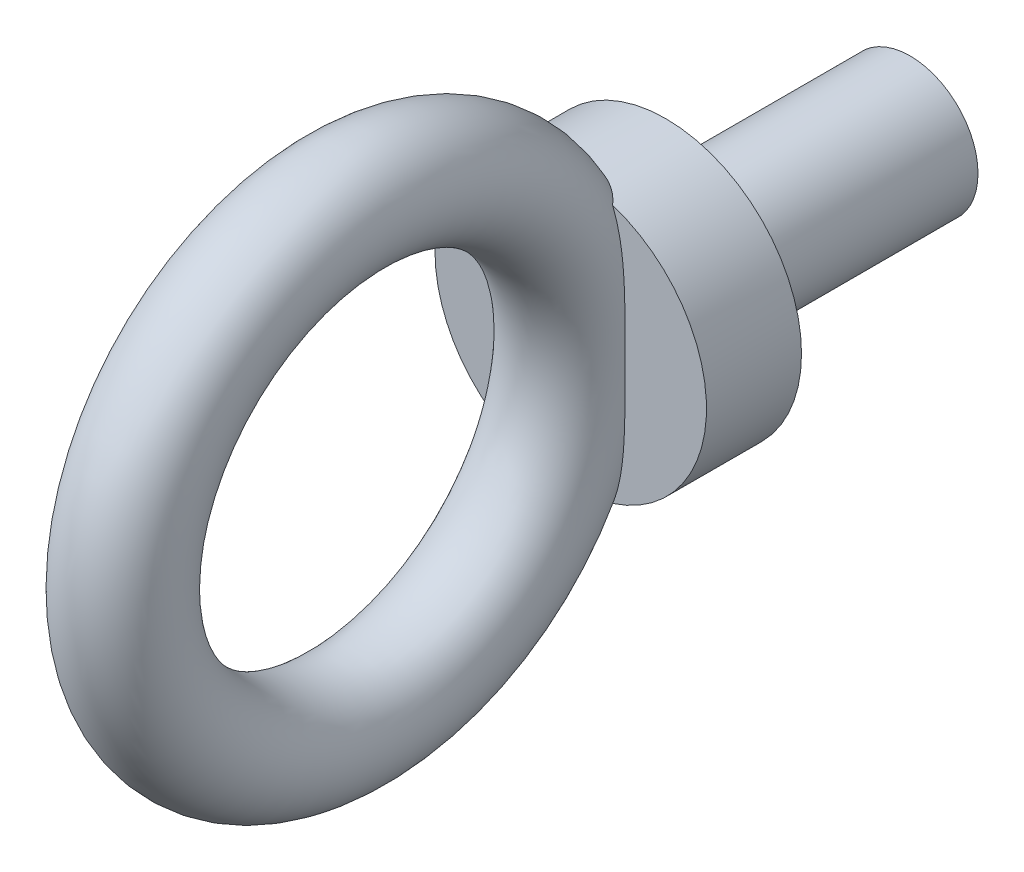
ISO-10303-21;
HEADER;
FILE_DESCRIPTION(('STEP AP214'),'2;1');
FILE_NAME('part.step','',(''),(''),'','','');
FILE_SCHEMA(('AUTOMOTIVE_DESIGN { 1 0 10303 214 1 1 1 1 }'));
ENDSEC;
DATA;
#1=APPLICATION_CONTEXT('core data for automotive mechanical design processes');
#2=APPLICATION_PROTOCOL_DEFINITION('international standard','automotive_design',2000,#1);
#3=PRODUCT_CONTEXT('',#1,'mechanical');
#4=PRODUCT('Part','Part','',(#3));
#5=PRODUCT_RELATED_PRODUCT_CATEGORY('part','',(#4));
#6=PRODUCT_DEFINITION_FORMATION('','',#4);
#7=PRODUCT_DEFINITION_CONTEXT('part definition',#1,'design');
#8=PRODUCT_DEFINITION('design','',#6,#7);
#9=PRODUCT_DEFINITION_SHAPE('','',#8);
#10=(LENGTH_UNIT() NAMED_UNIT(*) SI_UNIT(.MILLI.,.METRE.));
#11=(NAMED_UNIT(*) PLANE_ANGLE_UNIT() SI_UNIT($,.RADIAN.));
#12=(NAMED_UNIT(*) SI_UNIT($,.STERADIAN.) SOLID_ANGLE_UNIT());
#13=UNCERTAINTY_MEASURE_WITH_UNIT(LENGTH_MEASURE(1.E-05),#10,'distance_accuracy_value','');
#14=(GEOMETRIC_REPRESENTATION_CONTEXT(3) GLOBAL_UNCERTAINTY_ASSIGNED_CONTEXT((#13)) GLOBAL_UNIT_ASSIGNED_CONTEXT((#10,
#11,#12)) REPRESENTATION_CONTEXT('',''));
#15=CARTESIAN_POINT('',(0.,0.,0.));
#16=DIRECTION('',(0.,0.,1.));
#17=DIRECTION('',(1.,0.,0.));
#18=AXIS2_PLACEMENT_3D('',#15,#16,#17);
#19=CARTESIAN_POINT('',(0.,0.,25.));
#20=DIRECTION('',(0.,0.,-1.));
#21=DIRECTION('',(-1.,0.,0.));
#22=AXIS2_PLACEMENT_3D('',#19,#20,#21);
#23=CYLINDRICAL_SURFACE('',#22,5.);
#24=CARTESIAN_POINT('',(0.,0.,18.));
#25=DIRECTION('',(0.,0.,-1.));
#26=DIRECTION('',(-1.,0.,0.));
#27=AXIS2_PLACEMENT_3D('',#24,#25,#26);
#28=CIRCLE('',#27,5.);
#29=CARTESIAN_POINT('',(-5.,0.,18.));
#30=VERTEX_POINT('',#29);
#31=EDGE_CURVE('E44',#30,#30,#28,.T.);
#32=ORIENTED_EDGE('',*,*,#31,.T.);
#33=EDGE_LOOP('',(#32));
#34=FACE_BOUND('',#33,.T.);
#35=CARTESIAN_POINT('',(0.,0.,0.));
#36=DIRECTION('',(0.,0.,1.));
#37=DIRECTION('',(1.,0.,0.));
#38=AXIS2_PLACEMENT_3D('',#35,#36,#37);
#39=CIRCLE('',#38,5.);
#40=CARTESIAN_POINT('',(5.,0.,0.));
#41=VERTEX_POINT('',#40);
#42=EDGE_CURVE('E71',#41,#41,#39,.T.);
#43=ORIENTED_EDGE('',*,*,#42,.T.);
#44=EDGE_LOOP('',(#43));
#45=FACE_BOUND('',#44,.T.);
#46=ADVANCED_FACE('F41',(#34,#45),#23,.T.);
#47=CARTESIAN_POINT('',(0.,0.,0.));
#48=DIRECTION('',(0.,0.,1.));
#49=DIRECTION('',(1.,0.,0.));
#50=AXIS2_PLACEMENT_3D('',#47,#48,#49);
#51=PLANE('',#50);
#52=ORIENTED_EDGE('',*,*,#42,.F.);
#53=EDGE_LOOP('',(#52));
#54=FACE_BOUND('',#53,.T.);
#55=ADVANCED_FACE('F111',(#54),#51,.F.);
#56=CARTESIAN_POINT('',(0.,0.,18.));
#57=DIRECTION('',(0.,0.,-1.));
#58=DIRECTION('',(-1.,0.,0.));
#59=AXIS2_PLACEMENT_3D('',#56,#57,#58);
#60=PLANE('',#59);
#61=CARTESIAN_POINT('',(0.,0.,18.));
#62=DIRECTION('',(0.,0.,-1.));
#63=DIRECTION('',(-1.,0.,0.));
#64=AXIS2_PLACEMENT_3D('',#61,#62,#63);
#65=CIRCLE('',#64,10.);
#66=CARTESIAN_POINT('',(-10.,0.,18.));
#67=VERTEX_POINT('',#66);
#68=EDGE_CURVE('E82',#67,#67,#65,.T.);
#69=ORIENTED_EDGE('',*,*,#68,.T.);
#70=EDGE_LOOP('',(#69));
#71=FACE_BOUND('',#70,.T.);
#72=ORIENTED_EDGE('',*,*,#31,.F.);
#73=EDGE_LOOP('',(#72));
#74=FACE_BOUND('',#73,.T.);
#75=ADVANCED_FACE('F107',(#71,#74),#60,.T.);
#76=CARTESIAN_POINT('',(0.,0.,25.));
#77=DIRECTION('',(0.,0.,-1.));
#78=DIRECTION('',(-1.,0.,0.));
#79=AXIS2_PLACEMENT_3D('',#76,#77,#78);
#80=CYLINDRICAL_SURFACE('',#79,10.);
#81=ORIENTED_EDGE('',*,*,#68,.F.);
#82=EDGE_LOOP('',(#81));
#83=FACE_BOUND('',#82,.T.);
#84=CARTESIAN_POINT('',(3.08572184304947,9.51200928864808,25.0002));
#85=CARTESIAN_POINT('',(3.01756601337417,9.53412381358471,24.9175378057415));
#86=CARTESIAN_POINT('',(2.94580374612916,9.55658994722712,24.8379538660344));
#87=CARTESIAN_POINT('',(2.79561887336156,9.60159541408919,24.6853953160806));
#88=CARTESIAN_POINT('',(2.71719765726388,9.6241347310994,24.6124193335833));
#89=CARTESIAN_POINT('',(2.55435535244625,9.66862890900416,24.4736113090858));
#90=CARTESIAN_POINT('',(2.46994455302816,9.69058468720985,24.4077674842529));
#91=CARTESIAN_POINT('',(2.29561388577804,9.73335550958551,24.2834094722509));
#92=CARTESIAN_POINT('',(2.20569389556146,9.75417052839447,24.2248954479985));
#93=CARTESIAN_POINT('',(2.02101941430129,9.79410035671315,24.1154790566684));
#94=CARTESIAN_POINT('',(1.92626646082608,9.81321570171645,24.0645742887763));
#95=CARTESIAN_POINT('',(1.73253704998955,9.84926524220758,23.970539027512));
#96=CARTESIAN_POINT('',(1.63355903856122,9.866198625758,23.9274114257576));
#97=CARTESIAN_POINT('',(1.43213420654376,9.89744286380575,23.8491194834181));
#98=CARTESIAN_POINT('',(1.32968833422883,9.9117544284755,23.8139529857976));
#99=CARTESIAN_POINT('',(1.12197621895332,9.93741031264149,23.7516733654917));
#100=CARTESIAN_POINT('',(1.01670899615198,9.9487535861501,23.7245630812572));
#101=CARTESIAN_POINT('',(0.802547889080411,9.96833221510091,23.6781576217276));
#102=CARTESIAN_POINT('',(0.693623444827328,9.97651946364043,23.658983110066));
#103=CARTESIAN_POINT('',(0.474413725959301,9.98934363234647,23.6290874901616));
#104=CARTESIAN_POINT('',(0.364128438699724,9.99398051949858,23.6183664605267));
#105=CARTESIAN_POINT('',(0.14293474704309,9.99959062041027,23.6054076169455));
#106=CARTESIAN_POINT('',(0.0320261667254642,10.0005627418161,23.6031723323371));
#107=CARTESIAN_POINT('',(-0.189569384871622,9.99881675194974,23.607197771108));
#108=CARTESIAN_POINT('',(-0.300256418918661,9.99609990134791,23.6134555920509));
#109=CARTESIAN_POINT('',(-0.521707793453181,9.98700235759581,23.6345422774887));
#110=CARTESIAN_POINT('',(-0.632463160247915,9.98058760883945,23.6494508188513));
#111=CARTESIAN_POINT('',(-0.852169751938588,9.9642328996887,23.6878475985572));
#112=CARTESIAN_POINT('',(-0.961121633333386,9.95429425296488,23.711332639773));
#113=CARTESIAN_POINT('',(-1.17655273754486,9.93113630031529,23.7668270766499));
#114=CARTESIAN_POINT('',(-1.28303031787159,9.91791487962493,23.79884196822));
#115=CARTESIAN_POINT('',(-1.49262863963998,9.88854157661549,23.8712682003511));
#116=CARTESIAN_POINT('',(-1.59575065634544,9.87239082328377,23.9116763069705));
#117=CARTESIAN_POINT('',(-1.79772884048281,9.83761417268163,24.0006633433689));
#118=CARTESIAN_POINT('',(-1.89659292505752,9.81899315735014,24.0492262060951));
#119=CARTESIAN_POINT('',(-2.08950002951953,9.77975840898319,24.1543642672904));
#120=CARTESIAN_POINT('',(-2.18354496799336,9.75914547854557,24.2109362429034));
#121=CARTESIAN_POINT('',(-2.36604129797,9.71651278545709,24.3317800948635));
#122=CARTESIAN_POINT('',(-2.45449933387447,9.69449475902668,24.3960425512004));
#123=CARTESIAN_POINT('',(-2.62524933682342,9.64965560861289,24.5319742044604));
#124=CARTESIAN_POINT('',(-2.70754444751098,9.62683490291987,24.6036395802267));
#125=CARTESIAN_POINT('',(-2.83952830484846,9.5885418852331,24.7293435785358));
#126=CARTESIAN_POINT('',(-2.89106762387125,9.57311111818651,24.781466549554));
#127=CARTESIAN_POINT('',(-2.99086587807238,9.54240243331265,24.8886511149678));
#128=CARTESIAN_POINT('',(-3.03912969046047,9.52712431846331,24.9437081122132));
#129=CARTESIAN_POINT('',(-3.08572184304947,9.51200928864808,25.0002));
#130=B_SPLINE_CURVE_WITH_KNOTS('',3,(#84,#85,#86,#87,#88,#89,#90,#91,#92,#93,#94,#95,#96,#97,
#98,#99,#100,#101,#102,#103,#104,#105,#106,#107,#108,#109,#110,#111,#112,#113,#114,#115,#116,
#117,#118,#119,#120,#121,#122,#123,#124,#125,#126,#127,#128,#129),.UNSPECIFIED.,.F.,.F.,(4,2,2,
2,2,2,2,2,2,2,2,2,2,2,2,2,2,2,2,2,2,2,4),(0.,0.328072468338553,0.656076650045392,
0.983530403749523,1.31099143435226,1.63834892788182,1.96582788593589,2.29321800814123,
2.62072334352673,2.95304008938224,3.28535992537535,3.61777880784574,3.95008411798077,
4.28549981152457,4.62079059701109,4.95629793995148,5.29167624949145,5.62640136481433,
5.96099216804198,6.29517724957037,6.62919068901909,6.85379360816804,7.07805440442426),.UNSPECIFIED.);
#131=CARTESIAN_POINT('',(3.08555686335948,9.5120628069297,25.));
#132=VERTEX_POINT('',#131);
#133=CARTESIAN_POINT('',(-3.08555686337119,9.5120628069259,25.0000000000142));
#134=VERTEX_POINT('',#133);
#135=EDGE_CURVE('E11',#132,#134,#130,.T.);
#136=ORIENTED_EDGE('',*,*,#135,.F.);
#137=CARTESIAN_POINT('',(0.,0.,25.));
#138=DIRECTION('',(0.,0.,-1.));
#139=DIRECTION('',(-1.,0.,0.));
#140=AXIS2_PLACEMENT_3D('',#137,#138,#139);
#141=CIRCLE('',#140,10.);
#142=CARTESIAN_POINT('',(3.08555686337157,-9.51206280692577,25.));
#143=VERTEX_POINT('',#142);
#144=EDGE_CURVE('E70',#132,#143,#141,.T.);
#145=ORIENTED_EDGE('',*,*,#144,.T.);
#146=CARTESIAN_POINT('',(-3.08572184304947,-9.51200928864808,25.0002));
#147=CARTESIAN_POINT('',(-3.01756601337417,-9.53412381358471,24.9175378057416));
#148=CARTESIAN_POINT('',(-2.94580374612916,-9.55658994722712,24.8379538660344));
#149=CARTESIAN_POINT('',(-2.79561887336156,-9.60159541408919,24.6853953160806));
#150=CARTESIAN_POINT('',(-2.71719765726388,-9.6241347310994,24.6124193335833));
#151=CARTESIAN_POINT('',(-2.55435535244625,-9.66862890900416,24.4736113090858));
#152=CARTESIAN_POINT('',(-2.46994455302816,-9.69058468720985,24.4077674842529));
#153=CARTESIAN_POINT('',(-2.29561388577804,-9.73335550958551,24.2834094722509));
#154=CARTESIAN_POINT('',(-2.20569389556146,-9.75417052839447,24.2248954479985));
#155=CARTESIAN_POINT('',(-2.02101941430128,-9.79410035671315,24.1154790566684));
#156=CARTESIAN_POINT('',(-1.92626646082608,-9.81321570171645,24.0645742887763));
#157=CARTESIAN_POINT('',(-1.73253704998955,-9.84926524220758,23.970539027512));
#158=CARTESIAN_POINT('',(-1.63355903856122,-9.866198625758,23.9274114257576));
#159=CARTESIAN_POINT('',(-1.43213420654376,-9.89744286380575,23.8491194834181));
#160=CARTESIAN_POINT('',(-1.32968833422883,-9.9117544284755,23.8139529857976));
#161=CARTESIAN_POINT('',(-1.12197621895332,-9.93741031264149,23.7516733654917));
#162=CARTESIAN_POINT('',(-1.01670899615198,-9.9487535861501,23.7245630812572));
#163=CARTESIAN_POINT('',(-0.80254788908041,-9.96833221510091,23.6781576217276));
#164=CARTESIAN_POINT('',(-0.693623444827327,-9.97651946364043,23.658983110066));
#165=CARTESIAN_POINT('',(-0.4744137259593,-9.98934363234647,23.6290874901616));
#166=CARTESIAN_POINT('',(-0.364128438699723,-9.99398051949858,23.6183664605267));
#167=CARTESIAN_POINT('',(-0.142934747043089,-9.99959062041027,23.6054076169455));
#168=CARTESIAN_POINT('',(-0.032026166725463,-10.0005627418161,23.6031723323371));
#169=CARTESIAN_POINT('',(0.189569384871623,-9.99881675194974,23.607197771108));
#170=CARTESIAN_POINT('',(0.300256418918662,-9.99609990134791,23.6134555920509));
#171=CARTESIAN_POINT('',(0.521707793453182,-9.98700235759581,23.6345422774887));
#172=CARTESIAN_POINT('',(0.632463160247916,-9.98058760883945,23.6494508188513));
#173=CARTESIAN_POINT('',(0.852169751938589,-9.9642328996887,23.6878475985572));
#174=CARTESIAN_POINT('',(0.961121633333387,-9.95429425296488,23.711332639773));
#175=CARTESIAN_POINT('',(1.17655273754487,-9.93113630031529,23.7668270766499));
#176=CARTESIAN_POINT('',(1.28303031787159,-9.91791487962493,23.79884196822));
#177=CARTESIAN_POINT('',(1.49262863963998,-9.88854157661549,23.8712682003511));
#178=CARTESIAN_POINT('',(1.59575065634545,-9.87239082328377,23.9116763069705));
#179=CARTESIAN_POINT('',(1.79772884048282,-9.83761417268163,24.0006633433689));
#180=CARTESIAN_POINT('',(1.89659292505753,-9.81899315735014,24.0492262060951));
#181=CARTESIAN_POINT('',(2.08950002951953,-9.77975840898319,24.1543642672904));
#182=CARTESIAN_POINT('',(2.18354496799336,-9.75914547854557,24.2109362429034));
#183=CARTESIAN_POINT('',(2.36604129797,-9.71651278545709,24.3317800948635));
#184=CARTESIAN_POINT('',(2.45449933387447,-9.69449475902668,24.3960425512004));
#185=CARTESIAN_POINT('',(2.62524933682342,-9.64965560861289,24.5319742044604));
#186=CARTESIAN_POINT('',(2.70754444751098,-9.62683490291988,24.6036395802267));
#187=CARTESIAN_POINT('',(2.83952830484846,-9.5885418852331,24.7293435785358));
#188=CARTESIAN_POINT('',(2.89106762387125,-9.57311111818651,24.781466549554));
#189=CARTESIAN_POINT('',(2.99086587807238,-9.54240243331264,24.8886511149678));
#190=CARTESIAN_POINT('',(3.03912969046047,-9.52712431846331,24.9437081122132));
#191=CARTESIAN_POINT('',(3.08572184304947,-9.51200928864808,25.0002));
#192=B_SPLINE_CURVE_WITH_KNOTS('',3,(#146,#147,#148,#149,#150,#151,#152,#153,#154,#155,#156,
#157,#158,#159,#160,#161,#162,#163,#164,#165,#166,#167,#168,#169,#170,#171,#172,#173,#174,#175,
#176,#177,#178,#179,#180,#181,#182,#183,#184,#185,#186,#187,#188,#189,#190,#191),.UNSPECIFIED.,
.F.,.F.,(4,2,2,2,2,2,2,2,2,2,2,2,2,2,2,2,2,2,2,2,2,2,4),(0.,0.328072468338552,0.656076650045392,
0.983530403749527,1.31099143435226,1.63834892788182,1.96582788593589,2.29321800814123,
2.62072334352673,2.95304008938224,3.28535992537535,3.61777880784574,3.95008411798077,
4.28549981152457,4.62079059701109,4.95629793995148,5.29167624949145,5.62640136481433,
5.96099216804198,6.29517724957037,6.62919068901909,6.85379360816804,7.07805440442425),.UNSPECIFIED.);
#193=CARTESIAN_POINT('',(-3.08555686335948,-9.5120628069297,25.));
#194=VERTEX_POINT('',#193);
#195=EDGE_CURVE('E49',#194,#143,#192,.T.);
#196=ORIENTED_EDGE('',*,*,#195,.F.);
#197=EDGE_CURVE('E79',#194,#134,#141,.T.);
#198=ORIENTED_EDGE('',*,*,#197,.T.);
#199=EDGE_LOOP('',(#136,#145,#196,#198));
#200=FACE_BOUND('',#199,.T.);
#201=ADVANCED_FACE('F78',(#83,#200),#80,.T.);
#202=CARTESIAN_POINT('',(0.,0.,41.5));
#203=DIRECTION('',(-1.,0.,0.));
#204=DIRECTION('',(0.,0.,1.));
#205=AXIS2_PLACEMENT_3D('',#202,#203,#204);
#206=TOROIDAL_SURFACE('',#205,16.5,4.);
#207=ORIENTED_EDGE('',*,*,#135,.T.);
#208=CARTESIAN_POINT('',(0.,-12.1655250605965,25.));
#209=CARTESIAN_POINT('',(-0.0789069147054649,-12.1655243507478,25.));
#210=CARTESIAN_POINT('',(-0.157831122581786,-12.1615807519203,25.));
#211=CARTESIAN_POINT('',(-0.314940262581015,-12.1459014426254,25.));
#212=CARTESIAN_POINT('',(-0.393124668548354,-12.134160555515,25.));
#213=CARTESIAN_POINT('',(-0.548144514744508,-12.1031366616892,25.));
#214=CARTESIAN_POINT('',(-0.624976948538152,-12.0838386367978,25.));
#215=CARTESIAN_POINT('',(-0.776518413435776,-12.0381511620416,25.));
#216=CARTESIAN_POINT('',(-0.85122629174177,-12.0117579405039,25.));
#217=CARTESIAN_POINT('',(-1.06992243058772,-11.9233087333785,25.));
#218=CARTESIAN_POINT('',(-1.21011168172449,-11.8516397014559,25.));
#219=CARTESIAN_POINT('',(-1.47741331183101,-11.6875089874663,25.));
#220=CARTESIAN_POINT('',(-1.60452233081058,-11.5950419822471,25.));
#221=CARTESIAN_POINT('',(-1.90052780062162,-11.347539562913,25.));
#222=CARTESIAN_POINT('',(-2.06171112843669,-11.1833004124671,25.));
#223=CARTESIAN_POINT('',(-2.35633798370009,-10.8317166649169,25.));
#224=CARTESIAN_POINT('',(-2.48972454760089,-10.6443258504214,25.));
#225=CARTESIAN_POINT('',(-2.71034668543688,-10.2890591710418,25.));
#226=CARTESIAN_POINT('',(-2.80157194291895,-10.1236074123726,25.));
#227=CARTESIAN_POINT('',(-2.96934430820161,-9.78533191339027,25.));
#228=CARTESIAN_POINT('',(-3.04587980361458,-9.61250247179692,25.));
#229=CARTESIAN_POINT('',(-3.1861953149803,-9.26138721407676,25.));
#230=CARTESIAN_POINT('',(-3.24994911319022,-9.08309103054785,25.));
#231=CARTESIAN_POINT('',(-3.33711738127926,-8.81303870062099,25.));
#232=CARTESIAN_POINT('',(-3.3647561044608,-8.7226138550678,25.));
#233=CARTESIAN_POINT('',(-3.41742000803638,-8.5410070427837,25.));
#234=CARTESIAN_POINT('',(-3.44244523491019,-8.44982508954873,25.));
#235=CARTESIAN_POINT('',(-3.51530077728713,-8.16988840766417,25.));
#236=CARTESIAN_POINT('',(-3.55920311831735,-7.9801048546929,25.));
#237=CARTESIAN_POINT('',(-3.63821184601876,-7.5986954887982,25.));
#238=CARTESIAN_POINT('',(-3.67331569354714,-7.40706916060005,25.));
#239=CARTESIAN_POINT('',(-3.73606375714564,-7.02241622607946,25.));
#240=CARTESIAN_POINT('',(-3.76370051012685,-6.82938841538304,25.));
#241=CARTESIAN_POINT('',(-3.81264228153664,-6.4425232152606,25.));
#242=CARTESIAN_POINT('',(-3.83394654006625,-6.24868573150171,25.));
#243=CARTESIAN_POINT('',(-3.89014348776821,-5.66462601038166,25.));
#244=CARTESIAN_POINT('',(-3.91705024432226,-5.27364150316313,25.));
#245=CARTESIAN_POINT('',(-3.9569180074916,-4.49125884819657,25.));
#246=CARTESIAN_POINT('',(-3.96988556823979,-4.09986098154093,25.));
#247=CARTESIAN_POINT('',(-3.98773251168747,-3.31321315824217,25.));
#248=CARTESIAN_POINT('',(-3.99253446779035,-2.91796168222779,25.));
#249=CARTESIAN_POINT('',(-3.99826986239549,-2.12741252227795,25.));
#250=CARTESIAN_POINT('',(-3.99920298198332,-1.73211483721918,25.));
#251=CARTESIAN_POINT('',(-4.00006507774339,-0.942565233764237,25.));
#252=CARTESIAN_POINT('',(-3.99999670476938,-0.548313316316786,25.));
#253=CARTESIAN_POINT('',(-4.00000316580833,0.240178083655402,25.));
#254=CARTESIAN_POINT('',(-4.00007799532979,0.634417566182322,25.));
#255=CARTESIAN_POINT('',(-3.99973592635973,1.28821809931232,25.));
#256=CARTESIAN_POINT('',(-3.9994782772341,1.54777914420496,25.));
#257=CARTESIAN_POINT('',(-3.99808647666183,2.06689852880099,25.));
#258=CARTESIAN_POINT('',(-3.99695232924092,2.32645686851133,25.));
#259=CARTESIAN_POINT('',(-3.99289640542281,2.84585385828287,25.));
#260=CARTESIAN_POINT('',(-3.9899726204109,3.10569249536526,25.));
#261=CARTESIAN_POINT('',(-3.98112040122083,3.62531998058602,25.));
#262=CARTESIAN_POINT('',(-3.9751920110536,3.88510882939792,25.));
#263=CARTESIAN_POINT('',(-3.95885857511867,4.40390835442095,25.));
#264=CARTESIAN_POINT('',(-3.94846469923247,4.66291935913553,25.));
#265=CARTESIAN_POINT('',(-3.92144599129627,5.18065043065387,25.));
#266=CARTESIAN_POINT('',(-3.90482070291528,5.4393704747583,25.));
#267=CARTESIAN_POINT('',(-3.86332216514909,5.95587511568123,25.));
#268=CARTESIAN_POINT('',(-3.83845833986107,6.21366044266937,25.));
#269=CARTESIAN_POINT('',(-3.77813380191282,6.72796552157923,25.));
#270=CARTESIAN_POINT('',(-3.74267544439311,6.9844855419065,25.));
#271=CARTESIAN_POINT('',(-3.65766761333132,7.50007506648024,25.));
#272=CARTESIAN_POINT('',(-3.60787139123048,7.75910491529857,25.));
#273=CARTESIAN_POINT('',(-3.49107263201664,8.27353833316163,25.));
#274=CARTESIAN_POINT('',(-3.42405839075777,8.52893931032071,25.));
#275=CARTESIAN_POINT('',(-3.26936256521525,9.03185346309546,25.));
#276=CARTESIAN_POINT('',(-3.18180714523366,9.27940471438257,25.));
#277=CARTESIAN_POINT('',(-2.98139872375293,9.76387640260208,25.));
#278=CARTESIAN_POINT('',(-2.86858917249174,10.0008142696499,25.));
#279=CARTESIAN_POINT('',(-2.64731955206267,10.3957898516393,25.));
#280=CARTESIAN_POINT('',(-2.5459851192278,10.5577915350623,25.));
#281=CARTESIAN_POINT('',(-2.3250204464599,10.8692373439946,25.));
#282=CARTESIAN_POINT('',(-2.20537418645912,11.0186702946527,25.));
#283=CARTESIAN_POINT('',(-1.94498379186762,11.3008531119746,25.));
#284=CARTESIAN_POINT('',(-1.80404869514931,11.4334296219455,25.));
#285=CARTESIAN_POINT('',(-1.50157897893542,11.6726319150437,25.));
#286=CARTESIAN_POINT('',(-1.34008621272627,11.7793091780184,25.));
#287=CARTESIAN_POINT('',(-1.04315672096878,11.9347837413157,25.));
#288=CARTESIAN_POINT('',(-0.911833249921411,11.9914172111524,25.));
#289=CARTESIAN_POINT('',(-0.64158881530324,12.0821599660523,25.));
#290=CARTESIAN_POINT('',(-0.502673644631286,12.1162861725917,25.));
#291=CARTESIAN_POINT('',(-0.220337534270072,12.159555959302,25.));
#292=CARTESIAN_POINT('',(-0.0768998784013697,12.1685921700706,25.));
#293=CARTESIAN_POINT('',(0.209253735775991,12.1606128650916,25.));
#294=CARTESIAN_POINT('',(0.351969642260797,12.1435955045324,25.));
#295=CARTESIAN_POINT('',(0.623496328187674,12.0867380238065,25.));
#296=CARTESIAN_POINT('',(0.752622007114978,12.0483691189115,25.));
#297=CARTESIAN_POINT('',(1.00344318836628,11.9524364286619,25.));
#298=CARTESIAN_POINT('',(1.12513717123318,11.8948687334355,25.));
#299=CARTESIAN_POINT('',(1.40474899296648,11.7380650388128,25.));
#300=CARTESIAN_POINT('',(1.55845877380228,11.6313252969533,25.));
#301=CARTESIAN_POINT('',(1.84672436211741,11.3944441058234,25.));
#302=CARTESIAN_POINT('',(1.9812288190679,11.2642419486231,25.));
#303=CARTESIAN_POINT('',(2.2927853044443,10.9190493249271,25.));
#304=CARTESIAN_POINT('',(2.45841451280186,10.6937629121485,25.));
#305=CARTESIAN_POINT('',(2.67927050127767,10.3395663038539,25.));
#306=CARTESIAN_POINT('',(2.74831863133332,10.2187255174759,25.));
#307=CARTESIAN_POINT('',(2.87812439211098,9.97265698834649,25.));
#308=CARTESIAN_POINT('',(2.93888351418983,9.84743003986153,25.));
#309=CARTESIAN_POINT('',(3.09895915553402,9.49098791580194,25.));
#310=CARTESIAN_POINT('',(3.18973200430487,9.25593989130154,25.));
#311=CARTESIAN_POINT('',(3.35086061087446,8.77889922883704,25.));
#312=CARTESIAN_POINT('',(3.42119690620161,8.53690021057203,25.));
#313=CARTESIAN_POINT('',(3.54539799887515,8.04707817597951,25.));
#314=CARTESIAN_POINT('',(3.59915150796182,7.79922733661144,25.));
#315=CARTESIAN_POINT('',(3.66929508161875,7.42565638728169,25.));
#316=CARTESIAN_POINT('',(3.69092265735145,7.30087835006131,25.));
#317=CARTESIAN_POINT('',(3.73103920785541,7.0508302439555,25.));
#318=CARTESIAN_POINT('',(3.74952850871261,6.92556022757532,25.));
#319=CARTESIAN_POINT('',(3.8062032681533,6.50947229585707,25.));
#320=CARTESIAN_POINT('',(3.83827492504224,6.21781743717572,25.));
#321=CARTESIAN_POINT('',(3.89100391699593,5.63345709783754,25.));
#322=CARTESIAN_POINT('',(3.91165791545155,5.34075133519802,25.));
#323=CARTESIAN_POINT('',(3.94461306825475,4.75454955686569,25.));
#324=CARTESIAN_POINT('',(3.95690448128176,4.461053018026,25.));
#325=CARTESIAN_POINT('',(3.97568776966346,3.87391969378469,25.));
#326=CARTESIAN_POINT('',(3.98218020145632,3.58028292454469,25.));
#327=CARTESIAN_POINT('',(3.99153226497298,2.99148981040143,25.));
#328=CARTESIAN_POINT('',(3.99437356236824,2.69633321161234,25.));
#329=CARTESIAN_POINT('',(3.99807123688026,2.10600594311604,25.));
#330=CARTESIAN_POINT('',(3.99892758043085,1.8108352732553,25.));
#331=CARTESIAN_POINT('',(3.99986552876917,1.22073378707513,25.));
#332=CARTESIAN_POINT('',(3.99994776380455,0.925802971149149,25.));
#333=CARTESIAN_POINT('',(4.00001589779759,0.335944595028621,25.));
#334=CARTESIAN_POINT('',(4.00000179781193,0.0410170348338446,25.));
#335=CARTESIAN_POINT('',(3.99999725117454,-0.548440879328353,25.));
#336=CARTESIAN_POINT('',(4.00000677269333,-0.842971233313849,25.));
#337=CARTESIAN_POINT('',(3.99960978183079,-1.43203616878927,25.));
#338=CARTESIAN_POINT('',(3.99920326352488,-1.72657075027967,25.));
#339=CARTESIAN_POINT('',(3.9969926413415,-2.31592045375292,25.));
#340=CARTESIAN_POINT('',(3.99518719058201,-2.61073557246961,25.));
#341=CARTESIAN_POINT('',(3.98868417631124,-3.20033264434937,25.));
#342=CARTESIAN_POINT('',(3.98398668212932,-3.49511459813806,25.));
#343=CARTESIAN_POINT('',(3.96977125871069,-4.0828877481033,25.));
#344=CARTESIAN_POINT('',(3.96028103284071,-4.37587955014596,25.));
#345=CARTESIAN_POINT('',(3.93410975062519,-4.96160250307708,25.));
#346=CARTESIAN_POINT('',(3.91742778474921,-5.25433361630267,25.));
#347=CARTESIAN_POINT('',(3.87406440975155,-5.83863707820757,25.));
#348=CARTESIAN_POINT('',(3.84739813918774,-6.13021050920236,25.));
#349=CARTESIAN_POINT('',(3.78074388305697,-6.71180273742587,25.));
#350=CARTESIAN_POINT('',(3.7407610871818,-7.00182209563517,25.));
#351=CARTESIAN_POINT('',(3.6726408850401,-7.40619729527919,25.));
#352=CARTESIAN_POINT('',(3.65174026349956,-7.52178157855614,25.));
#353=CARTESIAN_POINT('',(3.60686111933355,-7.75236401371834,25.));
#354=CARTESIAN_POINT('',(3.5828822322065,-7.86736209451122,25.));
#355=CARTESIAN_POINT('',(3.50583253914503,-8.21144160495932,25.));
#356=CARTESIAN_POINT('',(3.44767869035319,-8.43942413113244,25.));
#357=CARTESIAN_POINT('',(3.3156228727565,-8.88886954873394,25.));
#358=CARTESIAN_POINT('',(3.24185062655104,-9.11037000907781,25.));
#359=CARTESIAN_POINT('',(3.07527028076006,-9.54597187456467,25.));
#360=CARTESIAN_POINT('',(2.98248199617687,-9.76008071270212,25.));
#361=CARTESIAN_POINT('',(2.7800763273539,-10.1656953834728,25.));
#362=CARTESIAN_POINT('',(2.67167260661838,-10.3577964275113,25.));
#363=CARTESIAN_POINT('',(2.43128974834394,-10.7276419008383,25.));
#364=CARTESIAN_POINT('',(2.29924526185602,-10.9053444994225,25.));
#365=CARTESIAN_POINT('',(2.00672741868784,-11.2407695189362,25.));
#366=CARTESIAN_POINT('',(1.84589130093157,-11.3981867905579,25.));
#367=CARTESIAN_POINT('',(1.58418002583356,-11.6082171230589,25.));
#368=CARTESIAN_POINT('',(1.49364400881623,-11.6738202027712,25.));
#369=CARTESIAN_POINT('',(1.30600014699371,-11.7947674958337,25.));
#370=CARTESIAN_POINT('',(1.20889736765897,-11.850119496173,25.));
#371=CARTESIAN_POINT('',(0.982072253744047,-11.9619872642064,25.));
#372=CARTESIAN_POINT('',(0.850539870474864,-12.014901832733,25.));
#373=CARTESIAN_POINT('',(0.580656998783189,-12.0980330757262,25.));
#374=CARTESIAN_POINT('',(0.442324525941088,-12.1283066088758,25.));
#375=CARTESIAN_POINT('',(0.25241432004364,-12.1526270933298,25.));
#376=CARTESIAN_POINT('',(0.202067711901396,-12.1574563861707,25.));
#377=CARTESIAN_POINT('',(0.101149803763995,-12.163905968675,25.));
#378=CARTESIAN_POINT('',(0.0505784544763443,-12.1655255156016,25.));
#379=CARTESIAN_POINT('',(0.,-12.1655250605965,25.));
#380=B_SPLINE_CURVE_WITH_KNOTS('',3,(#208,#209,#210,#211,#212,#213,#214,#215,#216,#217,#218,
#219,#220,#221,#222,#223,#224,#225,#226,#227,#228,#229,#230,#231,#232,#233,#234,#235,#236,#237,
#238,#239,#240,#241,#242,#243,#244,#245,#246,#247,#248,#249,#250,#251,#252,#253,#254,#255,#256,
#257,#258,#259,#260,#261,#262,#263,#264,#265,#266,#267,#268,#269,#270,#271,#272,#273,#274,#275,
#276,#277,#278,#279,#280,#281,#282,#283,#284,#285,#286,#287,#288,#289,#290,#291,#292,#293,#294,
#295,#296,#297,#298,#299,#300,#301,#302,#303,#304,#305,#306,#307,#308,#309,#310,#311,#312,#313,
#314,#315,#316,#317,#318,#319,#320,#321,#322,#323,#324,#325,#326,#327,#328,#329,#330,#331,#332,
#333,#334,#335,#336,#337,#338,#339,#340,#341,#342,#343,#344,#345,#346,#347,#348,#349,#350,#351,
#352,#353,#354,#355,#356,#357,#358,#359,#360,#361,#362,#363,#364,#365,#366,#367,#368,#369,#370,
#371,#372,#373,#374,#375,#376,#377,#378,#379),.UNSPECIFIED.,.T.,.F.,(4,2,2,2,2,2,2,2,2,2,2,2,2,
2,2,2,2,2,2,2,2,2,2,2,2,2,2,2,2,2,2,2,2,2,2,2,2,2,2,2,2,2,2,2,2,2,2,2,2,2,2,2,2,2,2,2,2,2,2,2,2,
2,2,2,2,2,2,2,2,2,2,2,2,2,2,2,2,2,2,2,2,2,2,2,2,4),(0.,0.236653037989011,0.473463347911546,
0.710746675001907,0.948156387715809,1.41805620568736,1.88807642963641,2.57455011359281,
3.26241703770399,3.82842161530125,4.39487179818934,4.96247225316937,5.24610386485973,
5.52973043144147,6.11384190309845,6.69812174894142,7.28298341897268,7.86791524406379,
9.04318645288841,10.2179048136339,11.4037010418135,12.5895950151462,13.7723506105925,
14.955069109985,15.7337522457583,16.5124318050835,17.2919869285281,18.0715306335188,
18.8491356529444,19.6267976280967,20.4035730859211,21.180175996628,21.9710366270448,
22.7624362829551,23.549096839424,24.3344141931304,24.9066410923873,25.4793714954395,
26.0575833321948,26.6346362727387,27.0619456356606,27.4889333702827,27.9177455482399,
28.3465880911057,28.7490008565638,29.1514956242752,29.7097607564435,30.2694916755755,
31.103344024327,31.5206850944356,31.9379509773048,32.6925817376546,33.4479288222661,
34.2082400334632,34.5881253316376,34.9679711332109,35.8478662433923,36.7280183516402,
37.6091939748402,38.4902850362123,39.3757834632627,40.2612968642475,41.1460892538311,
42.0308719382083,42.9144630441615,43.7980667330084,44.6825222077808,45.5669564808133,
46.4463360024864,47.3258267708372,48.2039893889346,49.0818101707892,49.4341498590263,
49.7865313068322,50.491853214475,51.1915318789895,51.8904851411769,52.5508053978674,
53.2129799467506,53.8841747715737,54.2190376238259,54.5536450526469,54.9771903029173,
55.3996682943343,55.5513251695129,55.7030171340675),.UNSPECIFIED.);
#381=EDGE_CURVE('E55',#194,#134,#380,.T.);
#382=ORIENTED_EDGE('',*,*,#381,.F.);
#383=ORIENTED_EDGE('',*,*,#195,.T.);
#384=EDGE_CURVE('E61',#132,#143,#380,.T.);
#385=ORIENTED_EDGE('',*,*,#384,.F.);
#386=EDGE_LOOP('',(#207,#382,#383,#385));
#387=FACE_BOUND('',#386,.T.);
#388=ADVANCED_FACE('F74',(#387),#206,.T.);
#389=CARTESIAN_POINT('',(0.,0.,25.));
#390=DIRECTION('',(0.,0.,1.));
#391=DIRECTION('',(1.,0.,0.));
#392=AXIS2_PLACEMENT_3D('',#389,#390,#391);
#393=PLANE('',#392);
#394=ORIENTED_EDGE('',*,*,#381,.T.);
#395=ORIENTED_EDGE('',*,*,#197,.F.);
#396=EDGE_LOOP('',(#394,#395));
#397=FACE_BOUND('',#396,.T.);
#398=ADVANCED_FACE('F95',(#397),#393,.T.);
#399=ORIENTED_EDGE('',*,*,#384,.T.);
#400=ORIENTED_EDGE('',*,*,#144,.F.);
#401=EDGE_LOOP('',(#399,#400));
#402=FACE_BOUND('',#401,.T.);
#403=ADVANCED_FACE('F68',(#402),#393,.T.);
#404=CLOSED_SHELL('',(#46,#55,#75,#201,#388,#398,#403));
#405=MANIFOLD_SOLID_BREP('B2',#404);
#406=ADVANCED_BREP_SHAPE_REPRESENTATION('',(#18,#405),#14);
#407=SHAPE_DEFINITION_REPRESENTATION(#9,#406);
ENDSEC;
END-ISO-10303-21;
